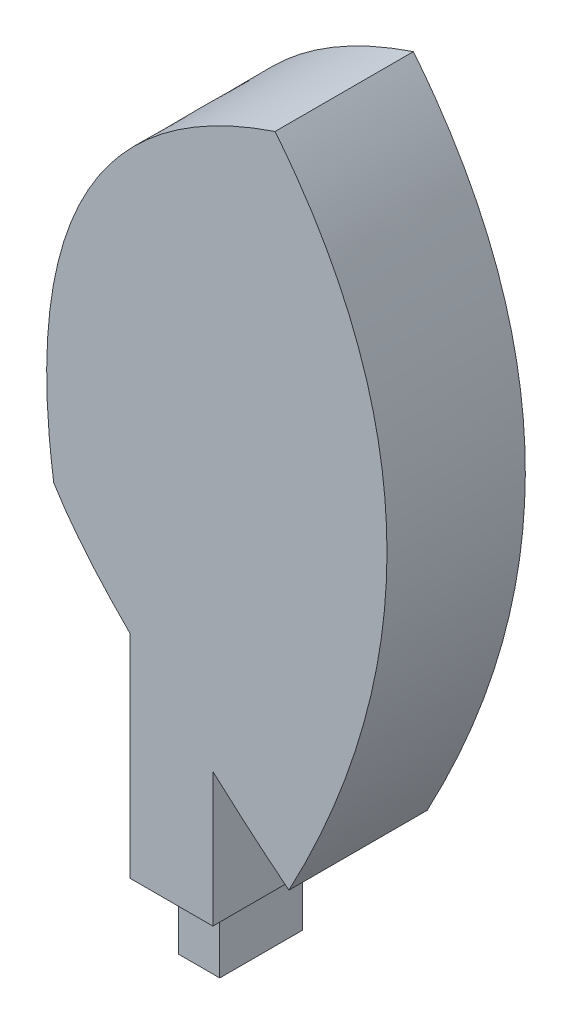
ISO-10303-21;
HEADER;
FILE_DESCRIPTION(('STEP AP214'),'2;1');
FILE_NAME('part.step','',(''),(''),'','','');
FILE_SCHEMA(('AUTOMOTIVE_DESIGN { 1 0 10303 214 1 1 1 1 }'));
ENDSEC;
DATA;
#1=APPLICATION_CONTEXT('core data for automotive mechanical design processes');
#2=APPLICATION_PROTOCOL_DEFINITION('international standard','automotive_design',2000,#1);
#3=PRODUCT_CONTEXT('',#1,'mechanical');
#4=PRODUCT('Part','Part','',(#3));
#5=PRODUCT_RELATED_PRODUCT_CATEGORY('part','',(#4));
#6=PRODUCT_DEFINITION_FORMATION('','',#4);
#7=PRODUCT_DEFINITION_CONTEXT('part definition',#1,'design');
#8=PRODUCT_DEFINITION('design','',#6,#7);
#9=PRODUCT_DEFINITION_SHAPE('','',#8);
#10=(LENGTH_UNIT() NAMED_UNIT(*) SI_UNIT(.MILLI.,.METRE.));
#11=(NAMED_UNIT(*) PLANE_ANGLE_UNIT() SI_UNIT($,.RADIAN.));
#12=(NAMED_UNIT(*) SI_UNIT($,.STERADIAN.) SOLID_ANGLE_UNIT());
#13=UNCERTAINTY_MEASURE_WITH_UNIT(LENGTH_MEASURE(1.E-05),#10,'distance_accuracy_value','');
#14=(GEOMETRIC_REPRESENTATION_CONTEXT(3) GLOBAL_UNCERTAINTY_ASSIGNED_CONTEXT((#13)) GLOBAL_UNIT_ASSIGNED_CONTEXT((#10,
#11,#12)) REPRESENTATION_CONTEXT('',''));
#15=CARTESIAN_POINT('',(0.,0.,0.));
#16=DIRECTION('',(0.,0.,1.));
#17=DIRECTION('',(1.,0.,0.));
#18=AXIS2_PLACEMENT_3D('',#15,#16,#17);
#19=CARTESIAN_POINT('',(6.92462782818049,-6.3665968359545,2.87499234463731));
#20=DIRECTION('',(0.,1.,0.));
#21=DIRECTION('',(0.,0.,1.));
#22=AXIS2_PLACEMENT_3D('',#19,#20,#21);
#23=PLANE('',#22);
#24=DIRECTION('',(-1.,0.,0.));
#25=VECTOR('',#24,1.);
#26=CARTESIAN_POINT('',(10.3265373401472,-6.3665968359545,7.12499234463731));
#27=LINE('',#26,#25);
#28=CARTESIAN_POINT('',(11.8121278281805,-6.3665968359545,7.12499234463731));
#29=VERTEX_POINT('',#28);
#30=CARTESIAN_POINT('',(9.26212782818049,-6.3665968359545,7.12499234463731));
#31=VERTEX_POINT('',#30);
#32=EDGE_CURVE('E11',#29,#31,#27,.T.);
#33=ORIENTED_EDGE('',*,*,#32,.T.);
#34=DIRECTION('',(0.,0.,-1.));
#35=VECTOR('',#34,1.);
#36=CARTESIAN_POINT('',(9.26212782818049,-6.3665968359545,2.87499234463731));
#37=LINE('',#36,#35);
#38=CARTESIAN_POINT('',(9.26212782818049,-6.3665968359545,2.87499234463731));
#39=VERTEX_POINT('',#38);
#40=EDGE_CURVE('E43',#31,#39,#37,.T.);
#41=ORIENTED_EDGE('',*,*,#40,.T.);
#42=DIRECTION('',(-1.,0.,0.));
#43=VECTOR('',#42,1.);
#44=CARTESIAN_POINT('',(10.3265373401472,-6.3665968359545,2.87499234463731));
#45=LINE('',#44,#43);
#46=CARTESIAN_POINT('',(11.8121278281805,-6.3665968359545,2.87499234463731));
#47=VERTEX_POINT('',#46);
#48=EDGE_CURVE('E139',#47,#39,#45,.T.);
#49=ORIENTED_EDGE('',*,*,#48,.F.);
#50=DIRECTION('',(0.,0.,1.));
#51=VECTOR('',#50,1.);
#52=CARTESIAN_POINT('',(11.8121278281805,-6.3665968359545,7.12499234463731));
#53=LINE('',#52,#51);
#54=EDGE_CURVE('E38',#47,#29,#53,.T.);
#55=ORIENTED_EDGE('',*,*,#54,.T.);
#56=EDGE_LOOP('',(#33,#41,#49,#55));
#57=FACE_BOUND('',#56,.T.);
#58=DIRECTION('',(0.,0.,-1.));
#59=VECTOR('',#58,1.);
#60=CARTESIAN_POINT('',(9.89962782549957,-6.3665968359545,6.27499234463731));
#61=LINE('',#60,#59);
#62=CARTESIAN_POINT('',(9.89962782549957,-6.3665968359545,6.27499234463731));
#63=VERTEX_POINT('',#62);
#64=CARTESIAN_POINT('',(9.89962782549957,-6.3665968359545,3.72499234463731));
#65=VERTEX_POINT('',#64);
#66=EDGE_CURVE('E51',#63,#65,#61,.T.);
#67=ORIENTED_EDGE('',*,*,#66,.F.);
#68=DIRECTION('',(-1.,0.,0.));
#69=VECTOR('',#68,1.);
#70=CARTESIAN_POINT('',(9.89962782549957,-6.3665968359545,6.27499234463731));
#71=LINE('',#70,#69);
#72=CARTESIAN_POINT('',(11.1746278254996,-6.3665968359545,6.27499234463731));
#73=VERTEX_POINT('',#72);
#74=EDGE_CURVE('E55',#73,#63,#71,.T.);
#75=ORIENTED_EDGE('',*,*,#74,.F.);
#76=DIRECTION('',(0.,0.,1.));
#77=VECTOR('',#76,1.);
#78=CARTESIAN_POINT('',(11.1746278254996,-6.3665968359545,6.27499234463731));
#79=LINE('',#78,#77);
#80=CARTESIAN_POINT('',(11.1746278254996,-6.3665968359545,3.72499234463731));
#81=VERTEX_POINT('',#80);
#82=EDGE_CURVE('E367',#81,#73,#79,.T.);
#83=ORIENTED_EDGE('',*,*,#82,.F.);
#84=DIRECTION('',(1.,0.,0.));
#85=VECTOR('',#84,1.);
#86=CARTESIAN_POINT('',(9.89962782549957,-6.3665968359545,3.72499234463731));
#87=LINE('',#86,#85);
#88=EDGE_CURVE('E373',#65,#81,#87,.T.);
#89=ORIENTED_EDGE('',*,*,#88,.F.);
#90=EDGE_LOOP('',(#67,#75,#83,#89));
#91=FACE_BOUND('',#90,.T.);
#92=ADVANCED_FACE('F35',(#57,#91),#23,.F.);
#93=CARTESIAN_POINT('',(10.3265373401472,-0.870674751866663,7.12499234463731));
#94=DIRECTION('',(0.,0.,-1.));
#95=DIRECTION('',(-1.,0.,0.));
#96=AXIS2_PLACEMENT_3D('',#93,#94,#95);
#97=PLANE('',#96);
#98=ORIENTED_EDGE('',*,*,#32,.F.);
#99=DIRECTION('',(0.,-1.,0.));
#100=VECTOR('',#99,1.);
#101=CARTESIAN_POINT('',(11.8121278281805,15.7342531640455,7.12499234463731));
#102=LINE('',#101,#100);
#103=CARTESIAN_POINT('',(11.8121278254996,-2.25046665961796,7.12499234463731));
#104=VERTEX_POINT('',#103);
#105=EDGE_CURVE('E154',#104,#29,#102,.T.);
#106=ORIENTED_EDGE('',*,*,#105,.F.);
#107=CARTESIAN_POINT('',(6.92462782818049,2.9834031640455,7.12499234463731));
#108=CARTESIAN_POINT('',(7.89538359439495,1.39823940318754,7.12499234463731));
#109=CARTESIAN_POINT('',(10.6559415619137,-1.17840490185873,7.12499234463731));
#110=CARTESIAN_POINT('',(12.6709043750028,-3.06151661363924,7.12499234463731));
#111=CARTESIAN_POINT('',(14.1496278281805,-4.2415968359545,7.12499234463731));
#112=B_SPLINE_CURVE_WITH_KNOTS('',3,(#107,#108,#109,#110,#111),.UNSPECIFIED.,.F.,.F.,(4,1,4),
(0.,0.559197283534878,1.),.UNSPECIFIED.);
#113=CARTESIAN_POINT('',(14.1496278281805,-4.2415968359545,7.12499234463731));
#114=VERTEX_POINT('',#113);
#115=EDGE_CURVE('E173',#104,#114,#112,.T.);
#116=ORIENTED_EDGE('',*,*,#115,.T.);
#117=CARTESIAN_POINT('',(14.1496278281805,-4.2415968359545,7.12499234463731));
#118=CARTESIAN_POINT('',(20.3821982823135,7.44305842768099,7.12499234463731));
#119=CARTESIAN_POINT('',(13.7246278281805,15.7334031640455,7.12499234463731));
#120=B_SPLINE_CURVE_WITH_KNOTS('',2,(#117,#118,#119),.UNSPECIFIED.,.F.,.F.,(3,3),(0.,1.),.UNSPECIFIED.);
#121=CARTESIAN_POINT('',(13.7246278281805,15.7334031640455,7.12499234463731));
#122=VERTEX_POINT('',#121);
#123=EDGE_CURVE('E172',#114,#122,#120,.T.);
#124=ORIENTED_EDGE('',*,*,#123,.T.);
#125=CARTESIAN_POINT('',(13.7246278281805,15.7334031640455,7.12499234463731));
#126=CARTESIAN_POINT('',(5.47129340260353,12.9572563703037,7.12499234463731));
#127=CARTESIAN_POINT('',(6.92462782818049,2.9834031640455,7.12499234463731));
#128=B_SPLINE_CURVE_WITH_KNOTS('',2,(#125,#126,#127),.UNSPECIFIED.,.F.,.F.,(3,3),(0.,1.),.UNSPECIFIED.);
#129=CARTESIAN_POINT('',(6.92462782818049,2.9834031640455,7.12499234463731));
#130=VERTEX_POINT('',#129);
#131=EDGE_CURVE('E197',#122,#130,#128,.T.);
#132=ORIENTED_EDGE('',*,*,#131,.T.);
#133=CARTESIAN_POINT('',(9.26212782798398,0.155279354130774,7.12499234463731));
#134=VERTEX_POINT('',#133);
#135=EDGE_CURVE('E166',#130,#134,#112,.T.);
#136=ORIENTED_EDGE('',*,*,#135,.T.);
#137=DIRECTION('',(0.,-1.,0.));
#138=VECTOR('',#137,1.);
#139=CARTESIAN_POINT('',(9.26212782818049,15.7342531640455,7.12499234463731));
#140=LINE('',#139,#138);
#141=EDGE_CURVE('E157',#134,#31,#140,.T.);
#142=ORIENTED_EDGE('',*,*,#141,.T.);
#143=EDGE_LOOP('',(#98,#106,#116,#124,#132,#136,#142));
#144=FACE_BOUND('',#143,.T.);
#145=ADVANCED_FACE('F242',(#144),#97,.F.);
#146=CARTESIAN_POINT('',(10.3265373401472,-0.870674751866663,2.87499234463731));
#147=DIRECTION('',(0.,0.,-1.));
#148=DIRECTION('',(-1.,0.,0.));
#149=AXIS2_PLACEMENT_3D('',#146,#147,#148);
#150=PLANE('',#149);
#151=DIRECTION('',(0.,-1.,0.));
#152=VECTOR('',#151,1.);
#153=CARTESIAN_POINT('',(11.8121278281805,15.7342531640455,2.87499234463731));
#154=LINE('',#153,#152);
#155=CARTESIAN_POINT('',(11.8121278281805,-2.25046665961796,2.87499234463731));
#156=VERTEX_POINT('',#155);
#157=EDGE_CURVE('E151',#156,#47,#154,.T.);
#158=ORIENTED_EDGE('',*,*,#157,.T.);
#159=ORIENTED_EDGE('',*,*,#48,.T.);
#160=DIRECTION('',(0.,-1.,0.));
#161=VECTOR('',#160,1.);
#162=CARTESIAN_POINT('',(9.26212782818049,15.7342531640455,2.87499234463731));
#163=LINE('',#162,#161);
#164=CARTESIAN_POINT('',(9.26212782798398,0.155279354130774,2.87499234463731));
#165=VERTEX_POINT('',#164);
#166=EDGE_CURVE('E141',#165,#39,#163,.T.);
#167=ORIENTED_EDGE('',*,*,#166,.F.);
#168=CARTESIAN_POINT('',(6.92462782818049,2.9834031640455,2.87499234463731));
#169=CARTESIAN_POINT('',(7.89538359439495,1.39823940318754,2.87499234463731));
#170=CARTESIAN_POINT('',(10.6559415619137,-1.17840490185873,2.87499234463731));
#171=CARTESIAN_POINT('',(12.6709043750028,-3.06151661363924,2.87499234463731));
#172=CARTESIAN_POINT('',(14.1496278281805,-4.2415968359545,2.87499234463731));
#173=B_SPLINE_CURVE_WITH_KNOTS('',3,(#168,#169,#170,#171,#172),.UNSPECIFIED.,.F.,.F.,(4,1,4),
(0.,0.559197283534878,1.),.UNSPECIFIED.);
#174=CARTESIAN_POINT('',(6.92462782818049,2.9834031640455,2.87499234463731));
#175=VERTEX_POINT('',#174);
#176=EDGE_CURVE('E203',#175,#165,#173,.T.);
#177=ORIENTED_EDGE('',*,*,#176,.F.);
#178=CARTESIAN_POINT('',(13.7246278281805,15.7334031640455,2.87499234463731));
#179=CARTESIAN_POINT('',(5.47129340260353,12.9572563703037,2.87499234463731));
#180=CARTESIAN_POINT('',(6.92462782818049,2.9834031640455,2.87499234463731));
#181=B_SPLINE_CURVE_WITH_KNOTS('',2,(#178,#179,#180),.UNSPECIFIED.,.F.,.F.,(3,3),(0.,1.),.UNSPECIFIED.);
#182=CARTESIAN_POINT('',(13.7246278281805,15.7334031640455,2.87499234463731));
#183=VERTEX_POINT('',#182);
#184=EDGE_CURVE('E217',#183,#175,#181,.T.);
#185=ORIENTED_EDGE('',*,*,#184,.F.);
#186=CARTESIAN_POINT('',(14.1496278281805,-4.2415968359545,2.87499234463731));
#187=CARTESIAN_POINT('',(20.3821982823135,7.44305842768099,2.87499234463731));
#188=CARTESIAN_POINT('',(13.7246278281805,15.7334031640455,2.87499234463731));
#189=B_SPLINE_CURVE_WITH_KNOTS('',2,(#186,#187,#188),.UNSPECIFIED.,.F.,.F.,(3,3),(0.,1.),.UNSPECIFIED.);
#190=CARTESIAN_POINT('',(14.1496278281805,-4.2415968359545,2.87499234463731));
#191=VERTEX_POINT('',#190);
#192=EDGE_CURVE('E210',#191,#183,#189,.T.);
#193=ORIENTED_EDGE('',*,*,#192,.F.);
#194=EDGE_CURVE('E164',#156,#191,#173,.T.);
#195=ORIENTED_EDGE('',*,*,#194,.F.);
#196=EDGE_LOOP('',(#158,#159,#167,#177,#185,#193,#195));
#197=FACE_BOUND('',#196,.T.);
#198=ADVANCED_FACE('F195',(#197),#150,.T.);
#199=CARTESIAN_POINT('',(9.26212782818049,15.7342531640455,2.87499234463731));
#200=DIRECTION('',(1.,0.,0.));
#201=DIRECTION('',(0.,0.,-1.));
#202=AXIS2_PLACEMENT_3D('',#199,#200,#201);
#203=PLANE('',#202);
#204=ORIENTED_EDGE('',*,*,#40,.F.);
#205=ORIENTED_EDGE('',*,*,#141,.F.);
#206=DIRECTION('',(0.,0.,-1.));
#207=VECTOR('',#206,1.);
#208=CARTESIAN_POINT('',(9.26212782818049,0.155279353934392,7.12499234463731));
#209=LINE('',#208,#207);
#210=EDGE_CURVE('E160',#165,#134,#209,.F.);
#211=ORIENTED_EDGE('',*,*,#210,.F.);
#212=ORIENTED_EDGE('',*,*,#166,.T.);
#213=EDGE_LOOP('',(#204,#205,#211,#212));
#214=FACE_BOUND('',#213,.T.);
#215=ADVANCED_FACE('F254',(#214),#203,.F.);
#216=CARTESIAN_POINT('',(11.8121278281805,15.7342531640455,7.12499234463731));
#217=DIRECTION('',(-1.,0.,0.));
#218=DIRECTION('',(0.,0.,1.));
#219=AXIS2_PLACEMENT_3D('',#216,#217,#218);
#220=PLANE('',#219);
#221=ORIENTED_EDGE('',*,*,#54,.F.);
#222=ORIENTED_EDGE('',*,*,#157,.F.);
#223=DIRECTION('',(0.,0.,-1.));
#224=VECTOR('',#223,1.);
#225=CARTESIAN_POINT('',(11.8121278281805,-2.25046666205792,7.12499234463731));
#226=LINE('',#225,#224);
#227=EDGE_CURVE('E161',#104,#156,#226,.T.);
#228=ORIENTED_EDGE('',*,*,#227,.F.);
#229=ORIENTED_EDGE('',*,*,#105,.T.);
#230=EDGE_LOOP('',(#221,#222,#228,#229));
#231=FACE_BOUND('',#230,.T.);
#232=ADVANCED_FACE('F185',(#231),#220,.F.);
#233=DIRECTION('',(0.,0.,-1.));
#234=VECTOR('',#233,1.);
#235=SURFACE_OF_LINEAR_EXTRUSION('',#112,#234);
#236=ORIENTED_EDGE('',*,*,#210,.T.);
#237=ORIENTED_EDGE('',*,*,#135,.F.);
#238=DIRECTION('',(0.,0.,-1.));
#239=VECTOR('',#238,1.);
#240=CARTESIAN_POINT('',(6.92462782818049,2.9834031640455,7.12499234463731));
#241=LINE('',#240,#239);
#242=EDGE_CURVE('E202',#130,#175,#241,.T.);
#243=ORIENTED_EDGE('',*,*,#242,.T.);
#244=ORIENTED_EDGE('',*,*,#176,.T.);
#245=EDGE_LOOP('',(#236,#237,#243,#244));
#246=FACE_BOUND('',#245,.T.);
#247=ADVANCED_FACE('F181',(#246),#235,.F.);
#248=ORIENTED_EDGE('',*,*,#227,.T.);
#249=ORIENTED_EDGE('',*,*,#194,.T.);
#250=DIRECTION('',(0.,0.,-1.));
#251=VECTOR('',#250,1.);
#252=CARTESIAN_POINT('',(14.1496278281805,-4.2415968359545,7.12499234463731));
#253=LINE('',#252,#251);
#254=EDGE_CURVE('E231',#114,#191,#253,.T.);
#255=ORIENTED_EDGE('',*,*,#254,.F.);
#256=ORIENTED_EDGE('',*,*,#115,.F.);
#257=EDGE_LOOP('',(#248,#249,#255,#256));
#258=FACE_BOUND('',#257,.T.);
#259=ADVANCED_FACE('F184',(#258),#235,.F.);
#260=DIRECTION('',(0.,0.,-1.));
#261=VECTOR('',#260,1.);
#262=SURFACE_OF_LINEAR_EXTRUSION('',#120,#261);
#263=ORIENTED_EDGE('',*,*,#192,.T.);
#264=DIRECTION('',(0.,0.,-1.));
#265=VECTOR('',#264,1.);
#266=CARTESIAN_POINT('',(13.7246278281805,15.7334031640455,7.12499234463731));
#267=LINE('',#266,#265);
#268=EDGE_CURVE('E229',#122,#183,#267,.T.);
#269=ORIENTED_EDGE('',*,*,#268,.F.);
#270=ORIENTED_EDGE('',*,*,#123,.F.);
#271=ORIENTED_EDGE('',*,*,#254,.T.);
#272=EDGE_LOOP('',(#263,#269,#270,#271));
#273=FACE_BOUND('',#272,.T.);
#274=ADVANCED_FACE('F187',(#273),#262,.F.);
#275=DIRECTION('',(0.,0.,-1.));
#276=VECTOR('',#275,1.);
#277=SURFACE_OF_LINEAR_EXTRUSION('',#128,#276);
#278=ORIENTED_EDGE('',*,*,#184,.T.);
#279=ORIENTED_EDGE('',*,*,#242,.F.);
#280=ORIENTED_EDGE('',*,*,#131,.F.);
#281=ORIENTED_EDGE('',*,*,#268,.T.);
#282=EDGE_LOOP('',(#278,#279,#280,#281));
#283=FACE_BOUND('',#282,.T.);
#284=ADVANCED_FACE('F190',(#283),#277,.F.);
#285=CARTESIAN_POINT('',(9.89962782549957,-8.4915968359545,6.27499234463731));
#286=DIRECTION('',(1.,0.,0.));
#287=DIRECTION('',(0.,0.,-1.));
#288=AXIS2_PLACEMENT_3D('',#285,#286,#287);
#289=PLANE('',#288);
#290=ORIENTED_EDGE('',*,*,#66,.T.);
#291=DIRECTION('',(0.,1.,0.));
#292=VECTOR('',#291,1.);
#293=CARTESIAN_POINT('',(9.89962782549957,-8.4915968359545,3.72499234463731));
#294=LINE('',#293,#292);
#295=CARTESIAN_POINT('',(9.89962782549957,-8.4915968359545,3.72499234463731));
#296=VERTEX_POINT('',#295);
#297=EDGE_CURVE('E122',#296,#65,#294,.T.);
#298=ORIENTED_EDGE('',*,*,#297,.F.);
#299=DIRECTION('',(0.,0.,-1.));
#300=VECTOR('',#299,1.);
#301=CARTESIAN_POINT('',(9.89962782549957,-8.4915968359545,6.27499234463731));
#302=LINE('',#301,#300);
#303=CARTESIAN_POINT('',(9.89962782549957,-8.4915968359545,6.27499234463731));
#304=VERTEX_POINT('',#303);
#305=EDGE_CURVE('E128',#304,#296,#302,.T.);
#306=ORIENTED_EDGE('',*,*,#305,.F.);
#307=DIRECTION('',(0.,1.,0.));
#308=VECTOR('',#307,1.);
#309=CARTESIAN_POINT('',(9.89962782549957,-8.4915968359545,6.27499234463731));
#310=LINE('',#309,#308);
#311=EDGE_CURVE('E365',#304,#63,#310,.T.);
#312=ORIENTED_EDGE('',*,*,#311,.T.);
#313=EDGE_LOOP('',(#290,#298,#306,#312));
#314=FACE_BOUND('',#313,.T.);
#315=ADVANCED_FACE('F138',(#314),#289,.F.);
#316=CARTESIAN_POINT('',(9.89962782549957,-8.4915968359545,3.72499234463731));
#317=DIRECTION('',(0.,0.,1.));
#318=DIRECTION('',(1.,0.,0.));
#319=AXIS2_PLACEMENT_3D('',#316,#317,#318);
#320=PLANE('',#319);
#321=ORIENTED_EDGE('',*,*,#88,.T.);
#322=DIRECTION('',(0.,1.,0.));
#323=VECTOR('',#322,1.);
#324=CARTESIAN_POINT('',(11.1746278254996,-8.4915968359545,3.72499234463731));
#325=LINE('',#324,#323);
#326=CARTESIAN_POINT('',(11.1746278254996,-8.4915968359545,3.72499234463731));
#327=VERTEX_POINT('',#326);
#328=EDGE_CURVE('E124',#327,#81,#325,.T.);
#329=ORIENTED_EDGE('',*,*,#328,.F.);
#330=DIRECTION('',(1.,0.,0.));
#331=VECTOR('',#330,1.);
#332=CARTESIAN_POINT('',(9.89962782549957,-8.4915968359545,3.72499234463731));
#333=LINE('',#332,#331);
#334=EDGE_CURVE('E117',#296,#327,#333,.T.);
#335=ORIENTED_EDGE('',*,*,#334,.F.);
#336=ORIENTED_EDGE('',*,*,#297,.T.);
#337=EDGE_LOOP('',(#321,#329,#335,#336));
#338=FACE_BOUND('',#337,.T.);
#339=ADVANCED_FACE('F120',(#338),#320,.F.);
#340=CARTESIAN_POINT('',(11.1746278254996,-8.4915968359545,6.27499234463731));
#341=DIRECTION('',(-1.,0.,0.));
#342=DIRECTION('',(0.,0.,1.));
#343=AXIS2_PLACEMENT_3D('',#340,#341,#342);
#344=PLANE('',#343);
#345=ORIENTED_EDGE('',*,*,#82,.T.);
#346=DIRECTION('',(0.,1.,0.));
#347=VECTOR('',#346,1.);
#348=CARTESIAN_POINT('',(11.1746278254996,-8.4915968359545,6.27499234463731));
#349=LINE('',#348,#347);
#350=CARTESIAN_POINT('',(11.1746278254996,-8.4915968359545,6.27499234463731));
#351=VERTEX_POINT('',#350);
#352=EDGE_CURVE('E143',#351,#73,#349,.T.);
#353=ORIENTED_EDGE('',*,*,#352,.F.);
#354=DIRECTION('',(0.,0.,1.));
#355=VECTOR('',#354,1.);
#356=CARTESIAN_POINT('',(11.1746278254996,-8.4915968359545,6.27499234463731));
#357=LINE('',#356,#355);
#358=EDGE_CURVE('E127',#327,#351,#357,.T.);
#359=ORIENTED_EDGE('',*,*,#358,.F.);
#360=ORIENTED_EDGE('',*,*,#328,.T.);
#361=EDGE_LOOP('',(#345,#353,#359,#360));
#362=FACE_BOUND('',#361,.T.);
#363=ADVANCED_FACE('F333',(#362),#344,.F.);
#364=CARTESIAN_POINT('',(9.89962782549957,-8.4915968359545,6.27499234463731));
#365=DIRECTION('',(0.,0.,-1.));
#366=DIRECTION('',(-1.,0.,0.));
#367=AXIS2_PLACEMENT_3D('',#364,#365,#366);
#368=PLANE('',#367);
#369=ORIENTED_EDGE('',*,*,#74,.T.);
#370=ORIENTED_EDGE('',*,*,#311,.F.);
#371=DIRECTION('',(-1.,0.,0.));
#372=VECTOR('',#371,1.);
#373=CARTESIAN_POINT('',(9.89962782549957,-8.4915968359545,6.27499234463731));
#374=LINE('',#373,#372);
#375=EDGE_CURVE('E133',#351,#304,#374,.T.);
#376=ORIENTED_EDGE('',*,*,#375,.F.);
#377=ORIENTED_EDGE('',*,*,#352,.T.);
#378=EDGE_LOOP('',(#369,#370,#376,#377));
#379=FACE_BOUND('',#378,.T.);
#380=ADVANCED_FACE('F342',(#379),#368,.F.);
#381=CARTESIAN_POINT('',(6.92462782818049,-8.4915968359545,2.87499234463731));
#382=DIRECTION('',(0.,-1.,0.));
#383=DIRECTION('',(0.,0.,-1.));
#384=AXIS2_PLACEMENT_3D('',#381,#382,#383);
#385=PLANE('',#384);
#386=ORIENTED_EDGE('',*,*,#305,.T.);
#387=ORIENTED_EDGE('',*,*,#334,.T.);
#388=ORIENTED_EDGE('',*,*,#358,.T.);
#389=ORIENTED_EDGE('',*,*,#375,.T.);
#390=EDGE_LOOP('',(#386,#387,#388,#389));
#391=FACE_BOUND('',#390,.T.);
#392=ADVANCED_FACE('F131',(#391),#385,.T.);
#393=CLOSED_SHELL('',(#92,#145,#198,#215,#232,#247,#259,#274,#284,#315,#339,#363,#380,#392));
#394=MANIFOLD_SOLID_BREP('B2',#393);
#395=ADVANCED_BREP_SHAPE_REPRESENTATION('',(#18,#394),#14);
#396=SHAPE_DEFINITION_REPRESENTATION(#9,#395);
ENDSEC;
END-ISO-10303-21;
